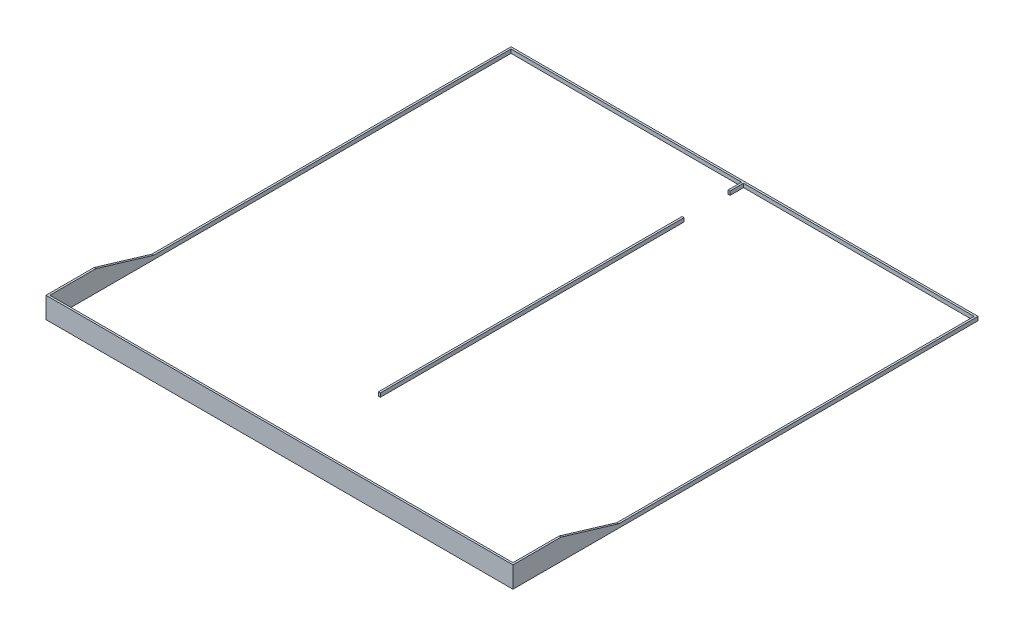
ISO-10303-21;
HEADER;
FILE_DESCRIPTION(('STEP AP214'),'2;1');
FILE_NAME('part.step','',(''),(''),'','','');
FILE_SCHEMA(('AUTOMOTIVE_DESIGN { 1 0 10303 214 1 1 1 1 }'));
ENDSEC;
DATA;
#1=APPLICATION_CONTEXT('core data for automotive mechanical design processes');
#2=APPLICATION_PROTOCOL_DEFINITION('international standard','automotive_design',2000,#1);
#3=PRODUCT_CONTEXT('',#1,'mechanical');
#4=PRODUCT('Part','Part','',(#3));
#5=PRODUCT_RELATED_PRODUCT_CATEGORY('part','',(#4));
#6=PRODUCT_DEFINITION_FORMATION('','',#4);
#7=PRODUCT_DEFINITION_CONTEXT('part definition',#1,'design');
#8=PRODUCT_DEFINITION('design','',#6,#7);
#9=PRODUCT_DEFINITION_SHAPE('','',#8);
#10=(LENGTH_UNIT() NAMED_UNIT(*) SI_UNIT(.MILLI.,.METRE.));
#11=(NAMED_UNIT(*) PLANE_ANGLE_UNIT() SI_UNIT($,.RADIAN.));
#12=(NAMED_UNIT(*) SI_UNIT($,.STERADIAN.) SOLID_ANGLE_UNIT());
#13=UNCERTAINTY_MEASURE_WITH_UNIT(LENGTH_MEASURE(1.E-05),#10,'distance_accuracy_value','');
#14=(GEOMETRIC_REPRESENTATION_CONTEXT(3) GLOBAL_UNCERTAINTY_ASSIGNED_CONTEXT((#13)) GLOBAL_UNIT_ASSIGNED_CONTEXT((#10,
#11,#12)) REPRESENTATION_CONTEXT('',''));
#15=CARTESIAN_POINT('',(0.,0.,0.));
#16=DIRECTION('',(0.,0.,1.));
#17=DIRECTION('',(1.,0.,0.));
#18=AXIS2_PLACEMENT_3D('',#15,#16,#17);
#19=CARTESIAN_POINT('',(24.9999999999999,550.,0.));
#20=DIRECTION('',(1.,0.,0.));
#21=DIRECTION('',(0.,0.,-1.));
#22=AXIS2_PLACEMENT_3D('',#19,#20,#21);
#23=PLANE('',#22);
#24=DIRECTION('',(0.,0.,-1.));
#25=VECTOR('',#24,1.);
#26=CARTESIAN_POINT('',(24.9999999999999,99.9999999999999,0.));
#27=LINE('',#26,#25);
#28=CARTESIAN_POINT('',(25.0000000000004,99.9999999999999,3450.));
#29=VERTEX_POINT('',#28);
#30=CARTESIAN_POINT('',(24.9999999999995,99.9999999999999,-4450.));
#31=VERTEX_POINT('',#30);
#32=EDGE_CURVE('E118',#29,#31,#27,.T.);
#33=ORIENTED_EDGE('',*,*,#32,.F.);
#34=DIRECTION('',(0.,-1.,0.));
#35=VECTOR('',#34,1.);
#36=CARTESIAN_POINT('',(25.0000000000003,550.,3450.));
#37=LINE('',#36,#35);
#38=CARTESIAN_POINT('',(25.0000000000003,0.,3450.));
#39=VERTEX_POINT('',#38);
#40=EDGE_CURVE('E100',#29,#39,#37,.T.);
#41=ORIENTED_EDGE('',*,*,#40,.T.);
#42=DIRECTION('',(0.,0.,1.));
#43=VECTOR('',#42,1.);
#44=CARTESIAN_POINT('',(24.9999999999999,0.,0.));
#45=LINE('',#44,#43);
#46=CARTESIAN_POINT('',(24.9999999999994,0.,-4450.));
#47=VERTEX_POINT('',#46);
#48=EDGE_CURVE('E143',#47,#39,#45,.T.);
#49=ORIENTED_EDGE('',*,*,#48,.F.);
#50=DIRECTION('',(0.,-1.,0.));
#51=VECTOR('',#50,1.);
#52=CARTESIAN_POINT('',(24.9999999999994,550.,-4450.));
#53=LINE('',#52,#51);
#54=EDGE_CURVE('E13',#31,#47,#53,.T.);
#55=ORIENTED_EDGE('',*,*,#54,.F.);
#56=EDGE_LOOP('',(#33,#41,#49,#55));
#57=FACE_BOUND('',#56,.T.);
#58=ADVANCED_FACE('F73',(#57),#23,.T.);
#59=CARTESIAN_POINT('',(0.,550.,-4450.));
#60=DIRECTION('',(0.,0.,-1.));
#61=DIRECTION('',(-1.,0.,0.));
#62=AXIS2_PLACEMENT_3D('',#59,#60,#61);
#63=PLANE('',#62);
#64=DIRECTION('',(-1.,0.,0.));
#65=VECTOR('',#64,1.);
#66=CARTESIAN_POINT('',(6075.,99.9999999999999,-4450.));
#67=LINE('',#66,#65);
#68=CARTESIAN_POINT('',(-25.0000000000005,99.9999999999999,-4450.));
#69=VERTEX_POINT('',#68);
#70=EDGE_CURVE('E111',#31,#69,#67,.T.);
#71=ORIENTED_EDGE('',*,*,#70,.F.);
#72=ORIENTED_EDGE('',*,*,#54,.T.);
#73=DIRECTION('',(1.,0.,0.));
#74=VECTOR('',#73,1.);
#75=CARTESIAN_POINT('',(0.,0.,-4450.));
#76=LINE('',#75,#74);
#77=CARTESIAN_POINT('',(-25.0000000000005,0.,-4450.));
#78=VERTEX_POINT('',#77);
#79=EDGE_CURVE('E134',#78,#47,#76,.T.);
#80=ORIENTED_EDGE('',*,*,#79,.F.);
#81=DIRECTION('',(0.,-1.,0.));
#82=VECTOR('',#81,1.);
#83=CARTESIAN_POINT('',(-25.0000000000005,550.,-4450.));
#84=LINE('',#83,#82);
#85=EDGE_CURVE('E82',#69,#78,#84,.T.);
#86=ORIENTED_EDGE('',*,*,#85,.F.);
#87=EDGE_LOOP('',(#71,#72,#80,#86));
#88=FACE_BOUND('',#87,.T.);
#89=ADVANCED_FACE('F128',(#88),#63,.T.);
#90=CARTESIAN_POINT('',(-25.,550.,0.));
#91=DIRECTION('',(1.,0.,0.));
#92=DIRECTION('',(0.,0.,-1.));
#93=AXIS2_PLACEMENT_3D('',#90,#91,#92);
#94=PLANE('',#93);
#95=DIRECTION('',(0.,-1.,0.));
#96=VECTOR('',#95,1.);
#97=CARTESIAN_POINT('',(-24.9999999999996,550.,3450.));
#98=LINE('',#97,#96);
#99=CARTESIAN_POINT('',(-24.9999999999996,99.9999999999999,3450.));
#100=VERTEX_POINT('',#99);
#101=CARTESIAN_POINT('',(-24.9999999999996,0.,3450.));
#102=VERTEX_POINT('',#101);
#103=EDGE_CURVE('E130',#100,#102,#98,.T.);
#104=ORIENTED_EDGE('',*,*,#103,.F.);
#105=DIRECTION('',(0.,0.,1.));
#106=VECTOR('',#105,1.);
#107=CARTESIAN_POINT('',(-24.9999999999996,99.9999999999999,3450.));
#108=LINE('',#107,#106);
#109=EDGE_CURVE('E90',#69,#100,#108,.T.);
#110=ORIENTED_EDGE('',*,*,#109,.F.);
#111=ORIENTED_EDGE('',*,*,#85,.T.);
#112=DIRECTION('',(0.,0.,1.));
#113=VECTOR('',#112,1.);
#114=CARTESIAN_POINT('',(-25.,0.,0.));
#115=LINE('',#114,#113);
#116=EDGE_CURVE('E139',#78,#102,#115,.T.);
#117=ORIENTED_EDGE('',*,*,#116,.T.);
#118=EDGE_LOOP('',(#104,#110,#111,#117));
#119=FACE_BOUND('',#118,.T.);
#120=ADVANCED_FACE('F123',(#119),#94,.F.);
#121=CARTESIAN_POINT('',(0.,550.,3450.));
#122=DIRECTION('',(0.,0.,-1.));
#123=DIRECTION('',(-1.,0.,0.));
#124=AXIS2_PLACEMENT_3D('',#121,#122,#123);
#125=PLANE('',#124);
#126=ORIENTED_EDGE('',*,*,#40,.F.);
#127=DIRECTION('',(-1.,0.,0.));
#128=VECTOR('',#127,1.);
#129=CARTESIAN_POINT('',(6075.,99.9999999999999,3450.));
#130=LINE('',#129,#128);
#131=EDGE_CURVE('E116',#29,#100,#130,.T.);
#132=ORIENTED_EDGE('',*,*,#131,.T.);
#133=ORIENTED_EDGE('',*,*,#103,.T.);
#134=DIRECTION('',(1.,0.,0.));
#135=VECTOR('',#134,1.);
#136=CARTESIAN_POINT('',(0.,0.,3450.));
#137=LINE('',#136,#135);
#138=EDGE_CURVE('E136',#102,#39,#137,.T.);
#139=ORIENTED_EDGE('',*,*,#138,.T.);
#140=EDGE_LOOP('',(#126,#132,#133,#139));
#141=FACE_BOUND('',#140,.T.);
#142=ADVANCED_FACE('F148',(#141),#125,.F.);
#143=CARTESIAN_POINT('',(0.,0.,0.));
#144=DIRECTION('',(0.,1.,0.));
#145=DIRECTION('',(0.,0.,1.));
#146=AXIS2_PLACEMENT_3D('',#143,#144,#145);
#147=PLANE('',#146);
#148=ORIENTED_EDGE('',*,*,#48,.T.);
#149=ORIENTED_EDGE('',*,*,#138,.F.);
#150=ORIENTED_EDGE('',*,*,#116,.F.);
#151=ORIENTED_EDGE('',*,*,#79,.T.);
#152=EDGE_LOOP('',(#148,#149,#150,#151));
#153=FACE_BOUND('',#152,.T.);
#154=ADVANCED_FACE('F149',(#153),#147,.F.);
#155=CARTESIAN_POINT('',(6075.,99.9999999999999,3450.));
#156=DIRECTION('',(0.,-1.,0.));
#157=DIRECTION('',(0.,0.,-1.));
#158=AXIS2_PLACEMENT_3D('',#155,#156,#157);
#159=PLANE('',#158);
#160=ORIENTED_EDGE('',*,*,#32,.T.);
#161=ORIENTED_EDGE('',*,*,#70,.T.);
#162=ORIENTED_EDGE('',*,*,#109,.T.);
#163=ORIENTED_EDGE('',*,*,#131,.F.);
#164=EDGE_LOOP('',(#160,#161,#162,#163));
#165=FACE_BOUND('',#164,.T.);
#166=ADVANCED_FACE('F113',(#165),#159,.F.);
#167=CLOSED_SHELL('',(#58,#89,#120,#142,#154,#166));
#168=MANIFOLD_SOLID_BREP('B2',#167);
#169=CARTESIAN_POINT('',(6075.,550.,-8.91848578459217E-13));
#170=DIRECTION('',(1.,0.,0.));
#171=DIRECTION('',(0.,0.,-1.));
#172=AXIS2_PLACEMENT_3D('',#169,#170,#171);
#173=PLANE('',#172);
#174=DIRECTION('',(0.,0.,-1.));
#175=VECTOR('',#174,1.);
#176=CARTESIAN_POINT('',(6075.,100.,3300.));
#177=LINE('',#176,#175);
#178=CARTESIAN_POINT('',(6075.,100.,3300.));
#179=VERTEX_POINT('',#178);
#180=CARTESIAN_POINT('',(6075.,100.,-6050.));
#181=VERTEX_POINT('',#180);
#182=EDGE_CURVE('E331',#179,#181,#177,.T.);
#183=ORIENTED_EDGE('',*,*,#182,.F.);
#184=DIRECTION('',(0.,-0.287347885566345,-0.957826285221151));
#185=VECTOR('',#184,1.);
#186=CARTESIAN_POINT('',(6075.,550.,4800.));
#187=LINE('',#186,#185);
#188=CARTESIAN_POINT('',(6075.,550.,4800.));
#189=VERTEX_POINT('',#188);
#190=EDGE_CURVE('E413',#189,#179,#187,.T.);
#191=ORIENTED_EDGE('',*,*,#190,.F.);
#192=DIRECTION('',(0.,0.,1.));
#193=VECTOR('',#192,1.);
#194=CARTESIAN_POINT('',(6075.,550.,-8.91848578459217E-13));
#195=LINE('',#194,#193);
#196=CARTESIAN_POINT('',(6075.,550.,6050.));
#197=VERTEX_POINT('',#196);
#198=EDGE_CURVE('E224',#189,#197,#195,.T.);
#199=ORIENTED_EDGE('',*,*,#198,.T.);
#200=DIRECTION('',(0.,-1.,0.));
#201=VECTOR('',#200,1.);
#202=CARTESIAN_POINT('',(6075.,550.,6050.));
#203=LINE('',#202,#201);
#204=CARTESIAN_POINT('',(6075.,0.,6050.));
#205=VERTEX_POINT('',#204);
#206=EDGE_CURVE('E270',#197,#205,#203,.T.);
#207=ORIENTED_EDGE('',*,*,#206,.T.);
#208=DIRECTION('',(0.,0.,1.));
#209=VECTOR('',#208,1.);
#210=CARTESIAN_POINT('',(6075.,0.,-8.91848578459217E-13));
#211=LINE('',#210,#209);
#212=CARTESIAN_POINT('',(6075.,0.,-6050.));
#213=VERTEX_POINT('',#212);
#214=EDGE_CURVE('E385',#213,#205,#211,.T.);
#215=ORIENTED_EDGE('',*,*,#214,.F.);
#216=DIRECTION('',(0.,-1.,0.));
#217=VECTOR('',#216,1.);
#218=CARTESIAN_POINT('',(6075.,550.,-6050.));
#219=LINE('',#218,#217);
#220=EDGE_CURVE('E397',#181,#213,#219,.T.);
#221=ORIENTED_EDGE('',*,*,#220,.F.);
#222=EDGE_LOOP('',(#183,#191,#199,#207,#215,#221));
#223=FACE_BOUND('',#222,.T.);
#224=ADVANCED_FACE('F200',(#223),#173,.T.);
#225=CARTESIAN_POINT('',(0.,550.,-6050.));
#226=DIRECTION('',(0.,0.,-1.));
#227=DIRECTION('',(-1.,0.,0.));
#228=AXIS2_PLACEMENT_3D('',#225,#226,#227);
#229=PLANE('',#228);
#230=DIRECTION('',(1.,0.,0.));
#231=VECTOR('',#230,1.);
#232=CARTESIAN_POINT('',(-6075.,100.,-6050.));
#233=LINE('',#232,#231);
#234=CARTESIAN_POINT('',(-6075.,100.,-6050.));
#235=VERTEX_POINT('',#234);
#236=EDGE_CURVE('E428',#235,#181,#233,.T.);
#237=ORIENTED_EDGE('',*,*,#236,.T.);
#238=ORIENTED_EDGE('',*,*,#220,.T.);
#239=DIRECTION('',(1.,0.,0.));
#240=VECTOR('',#239,1.);
#241=CARTESIAN_POINT('',(0.,0.,-6050.));
#242=LINE('',#241,#240);
#243=CARTESIAN_POINT('',(-6075.,0.,-6050.));
#244=VERTEX_POINT('',#243);
#245=EDGE_CURVE('E384',#244,#213,#242,.T.);
#246=ORIENTED_EDGE('',*,*,#245,.F.);
#247=DIRECTION('',(0.,-1.,0.));
#248=VECTOR('',#247,1.);
#249=CARTESIAN_POINT('',(-6075.,550.,-6050.));
#250=LINE('',#249,#248);
#251=EDGE_CURVE('E391',#235,#244,#250,.T.);
#252=ORIENTED_EDGE('',*,*,#251,.F.);
#253=EDGE_LOOP('',(#237,#238,#246,#252));
#254=FACE_BOUND('',#253,.T.);
#255=ADVANCED_FACE('F426',(#254),#229,.T.);
#256=CARTESIAN_POINT('',(-6075.,550.,1.33777286768882E-12));
#257=DIRECTION('',(1.,0.,0.));
#258=DIRECTION('',(0.,0.,-1.));
#259=AXIS2_PLACEMENT_3D('',#256,#257,#258);
#260=PLANE('',#259);
#261=DIRECTION('',(0.,-0.287347885566345,-0.957826285221151));
#262=VECTOR('',#261,1.);
#263=CARTESIAN_POINT('',(-6075.,550.,4800.));
#264=LINE('',#263,#262);
#265=CARTESIAN_POINT('',(-6075.,550.,4800.));
#266=VERTEX_POINT('',#265);
#267=CARTESIAN_POINT('',(-6075.,100.,3300.));
#268=VERTEX_POINT('',#267);
#269=EDGE_CURVE('E325',#266,#268,#264,.T.);
#270=ORIENTED_EDGE('',*,*,#269,.T.);
#271=DIRECTION('',(0.,0.,-1.));
#272=VECTOR('',#271,1.);
#273=CARTESIAN_POINT('',(-6075.,100.,3300.));
#274=LINE('',#273,#272);
#275=EDGE_CURVE('E334',#268,#235,#274,.T.);
#276=ORIENTED_EDGE('',*,*,#275,.T.);
#277=ORIENTED_EDGE('',*,*,#251,.T.);
#278=DIRECTION('',(0.,0.,1.));
#279=VECTOR('',#278,1.);
#280=CARTESIAN_POINT('',(-6075.,0.,1.33777286768882E-12));
#281=LINE('',#280,#279);
#282=CARTESIAN_POINT('',(-6075.,0.,6050.));
#283=VERTEX_POINT('',#282);
#284=EDGE_CURVE('E389',#244,#283,#281,.T.);
#285=ORIENTED_EDGE('',*,*,#284,.T.);
#286=DIRECTION('',(0.,-1.,0.));
#287=VECTOR('',#286,1.);
#288=CARTESIAN_POINT('',(-6075.,550.,6050.));
#289=LINE('',#288,#287);
#290=CARTESIAN_POINT('',(-6075.,550.,6050.));
#291=VERTEX_POINT('',#290);
#292=EDGE_CURVE('E349',#291,#283,#289,.T.);
#293=ORIENTED_EDGE('',*,*,#292,.F.);
#294=DIRECTION('',(0.,0.,1.));
#295=VECTOR('',#294,1.);
#296=CARTESIAN_POINT('',(-6075.,550.,1.33777286768882E-12));
#297=LINE('',#296,#295);
#298=EDGE_CURVE('E340',#266,#291,#297,.T.);
#299=ORIENTED_EDGE('',*,*,#298,.F.);
#300=EDGE_LOOP('',(#270,#276,#277,#285,#293,#299));
#301=FACE_BOUND('',#300,.T.);
#302=ADVANCED_FACE('F347',(#301),#260,.F.);
#303=CARTESIAN_POINT('',(6025.,550.,0.));
#304=DIRECTION('',(-1.,0.,0.));
#305=DIRECTION('',(0.,0.,1.));
#306=AXIS2_PLACEMENT_3D('',#303,#304,#305);
#307=PLANE('',#306);
#308=DIRECTION('',(0.,0.,1.));
#309=VECTOR('',#308,1.);
#310=CARTESIAN_POINT('',(6025.,100.,0.));
#311=LINE('',#310,#309);
#312=CARTESIAN_POINT('',(6025.,100.,-6000.));
#313=VERTEX_POINT('',#312);
#314=CARTESIAN_POINT('',(6025.,100.,3300.));
#315=VERTEX_POINT('',#314);
#316=EDGE_CURVE('E363',#313,#315,#311,.T.);
#317=ORIENTED_EDGE('',*,*,#316,.F.);
#318=DIRECTION('',(0.,-1.,0.));
#319=VECTOR('',#318,1.);
#320=CARTESIAN_POINT('',(6025.,550.,-6000.));
#321=LINE('',#320,#319);
#322=CARTESIAN_POINT('',(6025.,0.,-6000.));
#323=VERTEX_POINT('',#322);
#324=EDGE_CURVE('E354',#313,#323,#321,.T.);
#325=ORIENTED_EDGE('',*,*,#324,.T.);
#326=DIRECTION('',(0.,0.,-1.));
#327=VECTOR('',#326,1.);
#328=CARTESIAN_POINT('',(6025.,0.,0.));
#329=LINE('',#328,#327);
#330=CARTESIAN_POINT('',(6025.,0.,6000.));
#331=VERTEX_POINT('',#330);
#332=EDGE_CURVE('E357',#331,#323,#329,.T.);
#333=ORIENTED_EDGE('',*,*,#332,.F.);
#334=DIRECTION('',(0.,-1.,0.));
#335=VECTOR('',#334,1.);
#336=CARTESIAN_POINT('',(6025.,550.,6000.));
#337=LINE('',#336,#335);
#338=CARTESIAN_POINT('',(6025.,550.,6000.));
#339=VERTEX_POINT('',#338);
#340=EDGE_CURVE('E273',#339,#331,#337,.T.);
#341=ORIENTED_EDGE('',*,*,#340,.F.);
#342=DIRECTION('',(0.,0.,-1.));
#343=VECTOR('',#342,1.);
#344=CARTESIAN_POINT('',(6025.,550.,0.));
#345=LINE('',#344,#343);
#346=CARTESIAN_POINT('',(6025.,550.,4800.));
#347=VERTEX_POINT('',#346);
#348=EDGE_CURVE('E394',#339,#347,#345,.T.);
#349=ORIENTED_EDGE('',*,*,#348,.T.);
#350=DIRECTION('',(0.,0.287347885566346,0.957826285221152));
#351=VECTOR('',#350,1.);
#352=CARTESIAN_POINT('',(6025.,-771.100917431193,396.330275229358));
#353=LINE('',#352,#351);
#354=EDGE_CURVE('E212',#315,#347,#353,.T.);
#355=ORIENTED_EDGE('',*,*,#354,.F.);
#356=EDGE_LOOP('',(#317,#325,#333,#341,#349,#355));
#357=FACE_BOUND('',#356,.T.);
#358=ADVANCED_FACE('F203',(#357),#307,.T.);
#359=CARTESIAN_POINT('',(0.,550.,6000.));
#360=DIRECTION('',(0.,0.,-1.));
#361=DIRECTION('',(-1.,0.,0.));
#362=AXIS2_PLACEMENT_3D('',#359,#360,#361);
#363=PLANE('',#362);
#364=DIRECTION('',(1.,0.,0.));
#365=VECTOR('',#364,1.);
#366=CARTESIAN_POINT('',(0.,0.,6000.));
#367=LINE('',#366,#365);
#368=CARTESIAN_POINT('',(-6025.,0.,6000.));
#369=VERTEX_POINT('',#368);
#370=EDGE_CURVE('E360',#369,#331,#367,.T.);
#371=ORIENTED_EDGE('',*,*,#370,.F.);
#372=DIRECTION('',(0.,-1.,0.));
#373=VECTOR('',#372,1.);
#374=CARTESIAN_POINT('',(-6025.,550.,6000.));
#375=LINE('',#374,#373);
#376=CARTESIAN_POINT('',(-6025.,550.,6000.));
#377=VERTEX_POINT('',#376);
#378=EDGE_CURVE('E406',#377,#369,#375,.T.);
#379=ORIENTED_EDGE('',*,*,#378,.F.);
#380=DIRECTION('',(1.,0.,0.));
#381=VECTOR('',#380,1.);
#382=CARTESIAN_POINT('',(0.,550.,6000.));
#383=LINE('',#382,#381);
#384=EDGE_CURVE('E454',#377,#339,#383,.T.);
#385=ORIENTED_EDGE('',*,*,#384,.T.);
#386=ORIENTED_EDGE('',*,*,#340,.T.);
#387=EDGE_LOOP('',(#371,#379,#385,#386));
#388=FACE_BOUND('',#387,.T.);
#389=ADVANCED_FACE('F464',(#388),#363,.T.);
#390=CARTESIAN_POINT('',(-6025.,550.,1.33781874467331E-12));
#391=DIRECTION('',(1.,0.,0.));
#392=DIRECTION('',(0.,0.,-1.));
#393=AXIS2_PLACEMENT_3D('',#390,#391,#392);
#394=PLANE('',#393);
#395=DIRECTION('',(0.,0.,-1.));
#396=VECTOR('',#395,1.);
#397=CARTESIAN_POINT('',(-6025.,100.,1.33781874467331E-12));
#398=LINE('',#397,#396);
#399=CARTESIAN_POINT('',(-6025.,100.,3300.));
#400=VERTEX_POINT('',#399);
#401=CARTESIAN_POINT('',(-6025.,100.,-6000.));
#402=VERTEX_POINT('',#401);
#403=EDGE_CURVE('E450',#400,#402,#398,.T.);
#404=ORIENTED_EDGE('',*,*,#403,.F.);
#405=DIRECTION('',(0.,-0.287347885566346,-0.957826285221152));
#406=VECTOR('',#405,1.);
#407=CARTESIAN_POINT('',(-6025.,-771.100917431193,396.330275229359));
#408=LINE('',#407,#406);
#409=CARTESIAN_POINT('',(-6025.,550.,4800.));
#410=VERTEX_POINT('',#409);
#411=EDGE_CURVE('E429',#410,#400,#408,.T.);
#412=ORIENTED_EDGE('',*,*,#411,.F.);
#413=DIRECTION('',(0.,0.,1.));
#414=VECTOR('',#413,1.);
#415=CARTESIAN_POINT('',(-6025.,550.,1.33781874467331E-12));
#416=LINE('',#415,#414);
#417=EDGE_CURVE('E342',#410,#377,#416,.T.);
#418=ORIENTED_EDGE('',*,*,#417,.T.);
#419=ORIENTED_EDGE('',*,*,#378,.T.);
#420=DIRECTION('',(0.,0.,1.));
#421=VECTOR('',#420,1.);
#422=CARTESIAN_POINT('',(-6025.,0.,1.33781874467331E-12));
#423=LINE('',#422,#421);
#424=CARTESIAN_POINT('',(-6025.,0.,-6000.));
#425=VERTEX_POINT('',#424);
#426=EDGE_CURVE('E365',#425,#369,#423,.T.);
#427=ORIENTED_EDGE('',*,*,#426,.F.);
#428=DIRECTION('',(0.,-1.,0.));
#429=VECTOR('',#428,1.);
#430=CARTESIAN_POINT('',(-6025.,550.,-6000.));
#431=LINE('',#430,#429);
#432=EDGE_CURVE('E407',#402,#425,#431,.T.);
#433=ORIENTED_EDGE('',*,*,#432,.F.);
#434=EDGE_LOOP('',(#404,#412,#418,#419,#427,#433));
#435=FACE_BOUND('',#434,.T.);
#436=ADVANCED_FACE('F456',(#435),#394,.T.);
#437=CARTESIAN_POINT('',(0.,550.,-6000.));
#438=DIRECTION('',(0.,0.,-1.));
#439=DIRECTION('',(-1.,0.,0.));
#440=AXIS2_PLACEMENT_3D('',#437,#438,#439);
#441=PLANE('',#440);
#442=DIRECTION('',(0.,-1.,0.));
#443=VECTOR('',#442,1.);
#444=CARTESIAN_POINT('',(-25.0000000000012,550.,-6000.));
#445=LINE('',#444,#443);
#446=CARTESIAN_POINT('',(-25.0000000000012,100.,-6000.));
#447=VERTEX_POINT('',#446);
#448=CARTESIAN_POINT('',(-25.0000000000012,0.,-6000.));
#449=VERTEX_POINT('',#448);
#450=EDGE_CURVE('E408',#447,#449,#445,.T.);
#451=ORIENTED_EDGE('',*,*,#450,.F.);
#452=DIRECTION('',(-1.,0.,0.));
#453=VECTOR('',#452,1.);
#454=CARTESIAN_POINT('',(0.,100.,-6000.));
#455=LINE('',#454,#453);
#456=EDGE_CURVE('E448',#447,#402,#455,.T.);
#457=ORIENTED_EDGE('',*,*,#456,.T.);
#458=ORIENTED_EDGE('',*,*,#432,.T.);
#459=DIRECTION('',(1.,0.,0.));
#460=VECTOR('',#459,1.);
#461=CARTESIAN_POINT('',(0.,0.,-6000.));
#462=LINE('',#461,#460);
#463=EDGE_CURVE('E370',#425,#449,#462,.T.);
#464=ORIENTED_EDGE('',*,*,#463,.T.);
#465=EDGE_LOOP('',(#451,#457,#458,#464));
#466=FACE_BOUND('',#465,.T.);
#467=ADVANCED_FACE('F478',(#466),#441,.F.);
#468=CARTESIAN_POINT('',(-24.9999999999918,550.,0.));
#469=DIRECTION('',(1.,0.,0.));
#470=DIRECTION('',(0.,0.,-1.));
#471=AXIS2_PLACEMENT_3D('',#468,#469,#470);
#472=PLANE('',#471);
#473=DIRECTION('',(0.,-1.,0.));
#474=VECTOR('',#473,1.);
#475=CARTESIAN_POINT('',(-25.0000000000007,550.,-5650.));
#476=LINE('',#475,#474);
#477=CARTESIAN_POINT('',(-25.0000000000007,100.,-5650.));
#478=VERTEX_POINT('',#477);
#479=CARTESIAN_POINT('',(-25.0000000000007,0.,-5650.));
#480=VERTEX_POINT('',#479);
#481=EDGE_CURVE('E404',#478,#480,#476,.T.);
#482=ORIENTED_EDGE('',*,*,#481,.F.);
#483=DIRECTION('',(0.,0.,-1.));
#484=VECTOR('',#483,1.);
#485=CARTESIAN_POINT('',(-24.9999999999918,100.,0.));
#486=LINE('',#485,#484);
#487=EDGE_CURVE('E444',#478,#447,#486,.T.);
#488=ORIENTED_EDGE('',*,*,#487,.T.);
#489=ORIENTED_EDGE('',*,*,#450,.T.);
#490=DIRECTION('',(0.,0.,1.));
#491=VECTOR('',#490,1.);
#492=CARTESIAN_POINT('',(-24.9999999999918,0.,0.));
#493=LINE('',#492,#491);
#494=EDGE_CURVE('E367',#449,#480,#493,.T.);
#495=ORIENTED_EDGE('',*,*,#494,.T.);
#496=EDGE_LOOP('',(#482,#488,#489,#495));
#497=FACE_BOUND('',#496,.T.);
#498=ADVANCED_FACE('F477',(#497),#472,.F.);
#499=CARTESIAN_POINT('',(0.,550.,-5650.));
#500=DIRECTION('',(0.,0.,-1.));
#501=DIRECTION('',(-1.,0.,0.));
#502=AXIS2_PLACEMENT_3D('',#499,#500,#501);
#503=PLANE('',#502);
#504=DIRECTION('',(0.,-1.,0.));
#505=VECTOR('',#504,1.);
#506=CARTESIAN_POINT('',(24.9999999999993,550.,-5650.));
#507=LINE('',#506,#505);
#508=CARTESIAN_POINT('',(24.9999999999993,100.,-5650.));
#509=VERTEX_POINT('',#508);
#510=CARTESIAN_POINT('',(24.9999999999993,0.,-5650.));
#511=VERTEX_POINT('',#510);
#512=EDGE_CURVE('E405',#509,#511,#507,.T.);
#513=ORIENTED_EDGE('',*,*,#512,.F.);
#514=DIRECTION('',(-1.,0.,0.));
#515=VECTOR('',#514,1.);
#516=CARTESIAN_POINT('',(0.,100.,-5650.));
#517=LINE('',#516,#515);
#518=EDGE_CURVE('E439',#509,#478,#517,.T.);
#519=ORIENTED_EDGE('',*,*,#518,.T.);
#520=ORIENTED_EDGE('',*,*,#481,.T.);
#521=DIRECTION('',(1.,0.,0.));
#522=VECTOR('',#521,1.);
#523=CARTESIAN_POINT('',(0.,0.,-5650.));
#524=LINE('',#523,#522);
#525=EDGE_CURVE('E373',#480,#511,#524,.T.);
#526=ORIENTED_EDGE('',*,*,#525,.T.);
#527=EDGE_LOOP('',(#513,#519,#520,#526));
#528=FACE_BOUND('',#527,.T.);
#529=ADVANCED_FACE('F482',(#528),#503,.F.);
#530=CARTESIAN_POINT('',(24.9999999999993,550.,0.));
#531=DIRECTION('',(-1.,0.,0.));
#532=DIRECTION('',(0.,0.,1.));
#533=AXIS2_PLACEMENT_3D('',#530,#531,#532);
#534=PLANE('',#533);
#535=DIRECTION('',(0.,-1.,0.));
#536=VECTOR('',#535,1.);
#537=CARTESIAN_POINT('',(24.9999999999993,550.,-6000.));
#538=LINE('',#537,#536);
#539=CARTESIAN_POINT('',(24.9999999999993,100.,-6000.));
#540=VERTEX_POINT('',#539);
#541=CARTESIAN_POINT('',(24.9999999999993,0.,-6000.));
#542=VERTEX_POINT('',#541);
#543=EDGE_CURVE('E400',#540,#542,#538,.T.);
#544=ORIENTED_EDGE('',*,*,#543,.F.);
#545=DIRECTION('',(0.,0.,1.));
#546=VECTOR('',#545,1.);
#547=CARTESIAN_POINT('',(24.9999999999993,100.,0.));
#548=LINE('',#547,#546);
#549=EDGE_CURVE('E440',#540,#509,#548,.T.);
#550=ORIENTED_EDGE('',*,*,#549,.T.);
#551=ORIENTED_EDGE('',*,*,#512,.T.);
#552=DIRECTION('',(0.,0.,-1.));
#553=VECTOR('',#552,1.);
#554=CARTESIAN_POINT('',(24.9999999999993,0.,0.));
#555=LINE('',#554,#553);
#556=EDGE_CURVE('E376',#511,#542,#555,.T.);
#557=ORIENTED_EDGE('',*,*,#556,.T.);
#558=EDGE_LOOP('',(#544,#550,#551,#557));
#559=FACE_BOUND('',#558,.T.);
#560=ADVANCED_FACE('F486',(#559),#534,.F.);
#561=CARTESIAN_POINT('',(0.,550.,-6000.));
#562=DIRECTION('',(0.,0.,-1.));
#563=DIRECTION('',(-1.,0.,0.));
#564=AXIS2_PLACEMENT_3D('',#561,#562,#563);
#565=PLANE('',#564);
#566=ORIENTED_EDGE('',*,*,#324,.F.);
#567=DIRECTION('',(-1.,0.,0.));
#568=VECTOR('',#567,1.);
#569=CARTESIAN_POINT('',(0.,100.,-6000.));
#570=LINE('',#569,#568);
#571=EDGE_CURVE('E71',#313,#540,#570,.T.);
#572=ORIENTED_EDGE('',*,*,#571,.T.);
#573=ORIENTED_EDGE('',*,*,#543,.T.);
#574=DIRECTION('',(1.,0.,0.));
#575=VECTOR('',#574,1.);
#576=CARTESIAN_POINT('',(0.,0.,-6000.));
#577=LINE('',#576,#575);
#578=EDGE_CURVE('E377',#542,#323,#577,.T.);
#579=ORIENTED_EDGE('',*,*,#578,.T.);
#580=EDGE_LOOP('',(#566,#572,#573,#579));
#581=FACE_BOUND('',#580,.T.);
#582=ADVANCED_FACE('F466',(#581),#565,.F.);
#583=CARTESIAN_POINT('',(0.,550.,6050.));
#584=DIRECTION('',(0.,0.,-1.));
#585=DIRECTION('',(-1.,0.,0.));
#586=AXIS2_PLACEMENT_3D('',#583,#584,#585);
#587=PLANE('',#586);
#588=DIRECTION('',(1.,0.,0.));
#589=VECTOR('',#588,1.);
#590=CARTESIAN_POINT('',(0.,0.,6050.));
#591=LINE('',#590,#589);
#592=EDGE_CURVE('E388',#283,#205,#591,.T.);
#593=ORIENTED_EDGE('',*,*,#592,.T.);
#594=ORIENTED_EDGE('',*,*,#206,.F.);
#595=DIRECTION('',(1.,0.,0.));
#596=VECTOR('',#595,1.);
#597=CARTESIAN_POINT('',(0.,550.,6050.));
#598=LINE('',#597,#596);
#599=EDGE_CURVE('E348',#291,#197,#598,.T.);
#600=ORIENTED_EDGE('',*,*,#599,.F.);
#601=ORIENTED_EDGE('',*,*,#292,.T.);
#602=EDGE_LOOP('',(#593,#594,#600,#601));
#603=FACE_BOUND('',#602,.T.);
#604=ADVANCED_FACE('F420',(#603),#587,.F.);
#605=CARTESIAN_POINT('',(0.,550.,0.));
#606=DIRECTION('',(0.,1.,0.));
#607=DIRECTION('',(0.,0.,1.));
#608=AXIS2_PLACEMENT_3D('',#605,#606,#607);
#609=PLANE('',#608);
#610=DIRECTION('',(1.,0.,0.));
#611=VECTOR('',#610,1.);
#612=CARTESIAN_POINT('',(-6075.,550.,4800.));
#613=LINE('',#612,#611);
#614=EDGE_CURVE('E324',#266,#410,#613,.T.);
#615=ORIENTED_EDGE('',*,*,#614,.F.);
#616=ORIENTED_EDGE('',*,*,#298,.T.);
#617=ORIENTED_EDGE('',*,*,#599,.T.);
#618=ORIENTED_EDGE('',*,*,#198,.F.);
#619=DIRECTION('',(1.,0.,0.));
#620=VECTOR('',#619,1.);
#621=CARTESIAN_POINT('',(7.04670481745554E-13,550.,4800.));
#622=LINE('',#621,#620);
#623=EDGE_CURVE('E210',#347,#189,#622,.T.);
#624=ORIENTED_EDGE('',*,*,#623,.F.);
#625=ORIENTED_EDGE('',*,*,#348,.F.);
#626=ORIENTED_EDGE('',*,*,#384,.F.);
#627=ORIENTED_EDGE('',*,*,#417,.F.);
#628=EDGE_LOOP('',(#615,#616,#617,#618,#624,#625,#626,#627));
#629=FACE_BOUND('',#628,.T.);
#630=ADVANCED_FACE('F337',(#629),#609,.T.);
#631=CARTESIAN_POINT('',(0.,0.,0.));
#632=DIRECTION('',(0.,1.,0.));
#633=DIRECTION('',(0.,0.,1.));
#634=AXIS2_PLACEMENT_3D('',#631,#632,#633);
#635=PLANE('',#634);
#636=ORIENTED_EDGE('',*,*,#332,.T.);
#637=ORIENTED_EDGE('',*,*,#578,.F.);
#638=ORIENTED_EDGE('',*,*,#556,.F.);
#639=ORIENTED_EDGE('',*,*,#525,.F.);
#640=ORIENTED_EDGE('',*,*,#494,.F.);
#641=ORIENTED_EDGE('',*,*,#463,.F.);
#642=ORIENTED_EDGE('',*,*,#426,.T.);
#643=ORIENTED_EDGE('',*,*,#370,.T.);
#644=EDGE_LOOP('',(#636,#637,#638,#639,#640,#641,#642,#643));
#645=FACE_BOUND('',#644,.T.);
#646=ORIENTED_EDGE('',*,*,#214,.T.);
#647=ORIENTED_EDGE('',*,*,#592,.F.);
#648=ORIENTED_EDGE('',*,*,#284,.F.);
#649=ORIENTED_EDGE('',*,*,#245,.T.);
#650=EDGE_LOOP('',(#646,#647,#648,#649));
#651=FACE_BOUND('',#650,.T.);
#652=ADVANCED_FACE('F425',(#645,#651),#635,.F.);
#653=CARTESIAN_POINT('',(-6075.,550.,4800.));
#654=DIRECTION('',(0.,-0.957826285221151,0.287347885566345));
#655=DIRECTION('',(0.,-0.287347885566346,-0.957826285221152));
#656=AXIS2_PLACEMENT_3D('',#653,#654,#655);
#657=PLANE('',#656);
#658=ORIENTED_EDGE('',*,*,#354,.T.);
#659=ORIENTED_EDGE('',*,*,#623,.T.);
#660=ORIENTED_EDGE('',*,*,#190,.T.);
#661=DIRECTION('',(1.,0.,0.));
#662=VECTOR('',#661,1.);
#663=CARTESIAN_POINT('',(-6075.,100.,3300.));
#664=LINE('',#663,#662);
#665=EDGE_CURVE('E344',#315,#179,#664,.T.);
#666=ORIENTED_EDGE('',*,*,#665,.F.);
#667=EDGE_LOOP('',(#658,#659,#660,#666));
#668=FACE_BOUND('',#667,.T.);
#669=ADVANCED_FACE('F414',(#668),#657,.F.);
#670=CARTESIAN_POINT('',(-6075.,100.,3300.));
#671=DIRECTION('',(0.,-1.,0.));
#672=DIRECTION('',(0.,0.,-1.));
#673=AXIS2_PLACEMENT_3D('',#670,#671,#672);
#674=PLANE('',#673);
#675=ORIENTED_EDGE('',*,*,#316,.T.);
#676=ORIENTED_EDGE('',*,*,#665,.T.);
#677=ORIENTED_EDGE('',*,*,#182,.T.);
#678=ORIENTED_EDGE('',*,*,#236,.F.);
#679=ORIENTED_EDGE('',*,*,#275,.F.);
#680=EDGE_CURVE('E327',#268,#400,#664,.T.);
#681=ORIENTED_EDGE('',*,*,#680,.T.);
#682=ORIENTED_EDGE('',*,*,#403,.T.);
#683=ORIENTED_EDGE('',*,*,#456,.F.);
#684=ORIENTED_EDGE('',*,*,#487,.F.);
#685=ORIENTED_EDGE('',*,*,#518,.F.);
#686=ORIENTED_EDGE('',*,*,#549,.F.);
#687=ORIENTED_EDGE('',*,*,#571,.F.);
#688=EDGE_LOOP('',(#675,#676,#677,#678,#679,#681,#682,#683,#684,#685,#686,#687));
#689=FACE_BOUND('',#688,.T.);
#690=ADVANCED_FACE('F480',(#689),#674,.F.);
#691=ORIENTED_EDGE('',*,*,#411,.T.);
#692=ORIENTED_EDGE('',*,*,#680,.F.);
#693=ORIENTED_EDGE('',*,*,#269,.F.);
#694=ORIENTED_EDGE('',*,*,#614,.T.);
#695=EDGE_LOOP('',(#691,#692,#693,#694));
#696=FACE_BOUND('',#695,.T.);
#697=ADVANCED_FACE('F322',(#696),#657,.F.);
#698=CLOSED_SHELL('',(#224,#255,#302,#358,#389,#436,#467,#498,#529,#560,#582,#604,#630,#652,
#669,#690,#697));
#699=MANIFOLD_SOLID_BREP('B7',#698);
#700=ADVANCED_BREP_SHAPE_REPRESENTATION('',(#18,#168,#699),#14);
#701=SHAPE_DEFINITION_REPRESENTATION(#9,#700);
ENDSEC;
END-ISO-10303-21;
